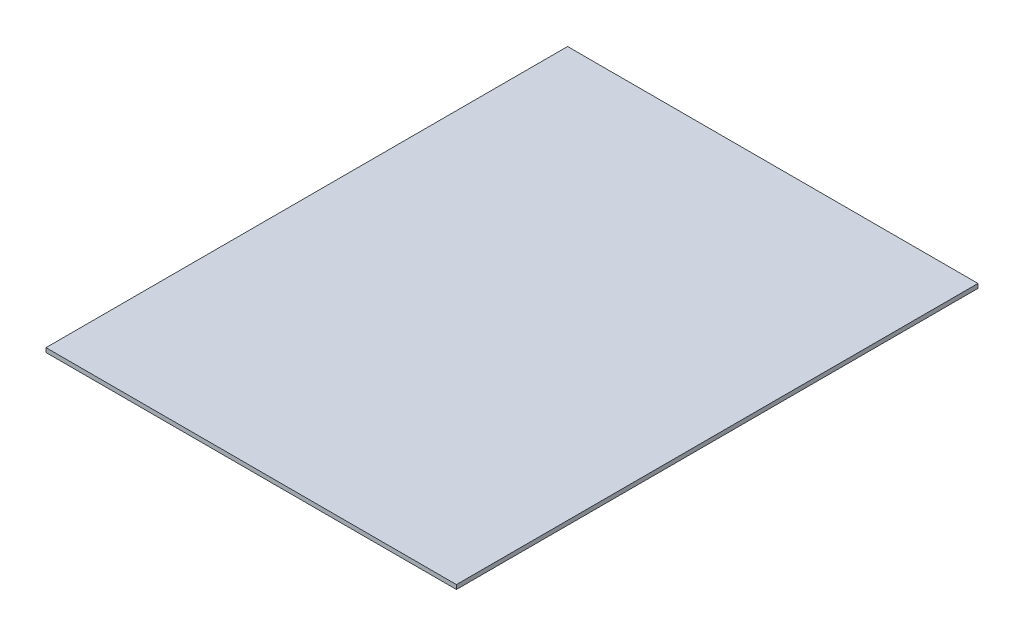
ISO-10303-21;
HEADER;
FILE_DESCRIPTION(('STEP AP214'),'2;1');
FILE_NAME('part.step','',(''),(''),'','','');
FILE_SCHEMA(('AUTOMOTIVE_DESIGN { 1 0 10303 214 1 1 1 1 }'));
ENDSEC;
DATA;
#1=APPLICATION_CONTEXT('core data for automotive mechanical design processes');
#2=APPLICATION_PROTOCOL_DEFINITION('international standard','automotive_design',2000,#1);
#3=PRODUCT_CONTEXT('',#1,'mechanical');
#4=PRODUCT('Part','Part','',(#3));
#5=PRODUCT_RELATED_PRODUCT_CATEGORY('part','',(#4));
#6=PRODUCT_DEFINITION_FORMATION('','',#4);
#7=PRODUCT_DEFINITION_CONTEXT('part definition',#1,'design');
#8=PRODUCT_DEFINITION('design','',#6,#7);
#9=PRODUCT_DEFINITION_SHAPE('','',#8);
#10=(LENGTH_UNIT() NAMED_UNIT(*) SI_UNIT(.MILLI.,.METRE.));
#11=(NAMED_UNIT(*) PLANE_ANGLE_UNIT() SI_UNIT($,.RADIAN.));
#12=(NAMED_UNIT(*) SI_UNIT($,.STERADIAN.) SOLID_ANGLE_UNIT());
#13=UNCERTAINTY_MEASURE_WITH_UNIT(LENGTH_MEASURE(1.E-05),#10,'distance_accuracy_value','');
#14=(GEOMETRIC_REPRESENTATION_CONTEXT(3) GLOBAL_UNCERTAINTY_ASSIGNED_CONTEXT((#13)) GLOBAL_UNIT_ASSIGNED_CONTEXT((#10,
#11,#12)) REPRESENTATION_CONTEXT('',''));
#15=CARTESIAN_POINT('',(0.,0.,0.));
#16=DIRECTION('',(0.,0.,1.));
#17=DIRECTION('',(1.,0.,0.));
#18=AXIS2_PLACEMENT_3D('',#15,#16,#17);
#19=CARTESIAN_POINT('',(152.4,3.175,193.675));
#20=DIRECTION('',(-1.,0.,0.));
#21=DIRECTION('',(0.,0.,1.));
#22=AXIS2_PLACEMENT_3D('',#19,#20,#21);
#23=PLANE('',#22);
#24=DIRECTION('',(0.,0.,-1.));
#25=VECTOR('',#24,1.);
#26=CARTESIAN_POINT('',(152.4,0.,193.675));
#27=LINE('',#26,#25);
#28=CARTESIAN_POINT('',(152.4,0.,193.675));
#29=VERTEX_POINT('',#28);
#30=CARTESIAN_POINT('',(152.4,0.,-193.675));
#31=VERTEX_POINT('',#30);
#32=EDGE_CURVE('E102',#29,#31,#27,.T.);
#33=ORIENTED_EDGE('',*,*,#32,.T.);
#34=DIRECTION('',(0.,-1.,0.));
#35=VECTOR('',#34,1.);
#36=CARTESIAN_POINT('',(152.4,3.175,-193.675));
#37=LINE('',#36,#35);
#38=CARTESIAN_POINT('',(152.4,3.175,-193.675));
#39=VERTEX_POINT('',#38);
#40=EDGE_CURVE('E11',#39,#31,#37,.T.);
#41=ORIENTED_EDGE('',*,*,#40,.F.);
#42=DIRECTION('',(0.,0.,-1.));
#43=VECTOR('',#42,1.);
#44=CARTESIAN_POINT('',(152.4,3.175,193.675));
#45=LINE('',#44,#43);
#46=CARTESIAN_POINT('',(152.4,3.175,193.675));
#47=VERTEX_POINT('',#46);
#48=EDGE_CURVE('E90',#47,#39,#45,.T.);
#49=ORIENTED_EDGE('',*,*,#48,.F.);
#50=DIRECTION('',(0.,-1.,0.));
#51=VECTOR('',#50,1.);
#52=CARTESIAN_POINT('',(152.4,3.175,193.675));
#53=LINE('',#52,#51);
#54=EDGE_CURVE('E98',#47,#29,#53,.T.);
#55=ORIENTED_EDGE('',*,*,#54,.T.);
#56=EDGE_LOOP('',(#33,#41,#49,#55));
#57=FACE_BOUND('',#56,.T.);
#58=ADVANCED_FACE('F39',(#57),#23,.F.);
#59=CARTESIAN_POINT('',(-152.4,3.175,-193.675));
#60=DIRECTION('',(0.,0.,1.));
#61=DIRECTION('',(1.,0.,0.));
#62=AXIS2_PLACEMENT_3D('',#59,#60,#61);
#63=PLANE('',#62);
#64=DIRECTION('',(-1.,0.,0.));
#65=VECTOR('',#64,1.);
#66=CARTESIAN_POINT('',(-152.4,0.,-193.675));
#67=LINE('',#66,#65);
#68=CARTESIAN_POINT('',(-152.4,0.,-193.675));
#69=VERTEX_POINT('',#68);
#70=EDGE_CURVE('E94',#31,#69,#67,.T.);
#71=ORIENTED_EDGE('',*,*,#70,.T.);
#72=DIRECTION('',(0.,-1.,0.));
#73=VECTOR('',#72,1.);
#74=CARTESIAN_POINT('',(-152.4,3.175,-193.675));
#75=LINE('',#74,#73);
#76=CARTESIAN_POINT('',(-152.4,3.175,-193.675));
#77=VERTEX_POINT('',#76);
#78=EDGE_CURVE('E47',#77,#69,#75,.T.);
#79=ORIENTED_EDGE('',*,*,#78,.F.);
#80=DIRECTION('',(-1.,0.,0.));
#81=VECTOR('',#80,1.);
#82=CARTESIAN_POINT('',(-152.4,3.175,-193.675));
#83=LINE('',#82,#81);
#84=EDGE_CURVE('E85',#39,#77,#83,.T.);
#85=ORIENTED_EDGE('',*,*,#84,.F.);
#86=ORIENTED_EDGE('',*,*,#40,.T.);
#87=EDGE_LOOP('',(#71,#79,#85,#86));
#88=FACE_BOUND('',#87,.T.);
#89=ADVANCED_FACE('F93',(#88),#63,.F.);
#90=CARTESIAN_POINT('',(-152.4,3.175,193.675));
#91=DIRECTION('',(1.,0.,0.));
#92=DIRECTION('',(0.,0.,-1.));
#93=AXIS2_PLACEMENT_3D('',#90,#91,#92);
#94=PLANE('',#93);
#95=DIRECTION('',(0.,0.,1.));
#96=VECTOR('',#95,1.);
#97=CARTESIAN_POINT('',(-152.4,0.,193.675));
#98=LINE('',#97,#96);
#99=CARTESIAN_POINT('',(-152.4,0.,193.675));
#100=VERTEX_POINT('',#99);
#101=EDGE_CURVE('E72',#69,#100,#98,.T.);
#102=ORIENTED_EDGE('',*,*,#101,.T.);
#103=DIRECTION('',(0.,-1.,0.));
#104=VECTOR('',#103,1.);
#105=CARTESIAN_POINT('',(-152.4,3.175,193.675));
#106=LINE('',#105,#104);
#107=CARTESIAN_POINT('',(-152.4,3.175,193.675));
#108=VERTEX_POINT('',#107);
#109=EDGE_CURVE('E95',#108,#100,#106,.T.);
#110=ORIENTED_EDGE('',*,*,#109,.F.);
#111=DIRECTION('',(0.,0.,1.));
#112=VECTOR('',#111,1.);
#113=CARTESIAN_POINT('',(-152.4,3.175,193.675));
#114=LINE('',#113,#112);
#115=EDGE_CURVE('E88',#77,#108,#114,.T.);
#116=ORIENTED_EDGE('',*,*,#115,.F.);
#117=ORIENTED_EDGE('',*,*,#78,.T.);
#118=EDGE_LOOP('',(#102,#110,#116,#117));
#119=FACE_BOUND('',#118,.T.);
#120=ADVANCED_FACE('F96',(#119),#94,.F.);
#121=CARTESIAN_POINT('',(-152.4,3.175,193.675));
#122=DIRECTION('',(0.,0.,-1.));
#123=DIRECTION('',(-1.,0.,0.));
#124=AXIS2_PLACEMENT_3D('',#121,#122,#123);
#125=PLANE('',#124);
#126=DIRECTION('',(1.,0.,0.));
#127=VECTOR('',#126,1.);
#128=CARTESIAN_POINT('',(-152.4,0.,193.675));
#129=LINE('',#128,#127);
#130=EDGE_CURVE('E78',#100,#29,#129,.T.);
#131=ORIENTED_EDGE('',*,*,#130,.T.);
#132=ORIENTED_EDGE('',*,*,#54,.F.);
#133=DIRECTION('',(1.,0.,0.));
#134=VECTOR('',#133,1.);
#135=CARTESIAN_POINT('',(-152.4,3.175,193.675));
#136=LINE('',#135,#134);
#137=EDGE_CURVE('E55',#108,#47,#136,.T.);
#138=ORIENTED_EDGE('',*,*,#137,.F.);
#139=ORIENTED_EDGE('',*,*,#109,.T.);
#140=EDGE_LOOP('',(#131,#132,#138,#139));
#141=FACE_BOUND('',#140,.T.);
#142=ADVANCED_FACE('F109',(#141),#125,.F.);
#143=CARTESIAN_POINT('',(0.,3.175,0.));
#144=DIRECTION('',(0.,-1.,0.));
#145=DIRECTION('',(0.,0.,-1.));
#146=AXIS2_PLACEMENT_3D('',#143,#144,#145);
#147=PLANE('',#146);
#148=ORIENTED_EDGE('',*,*,#48,.T.);
#149=ORIENTED_EDGE('',*,*,#84,.T.);
#150=ORIENTED_EDGE('',*,*,#115,.T.);
#151=ORIENTED_EDGE('',*,*,#137,.T.);
#152=EDGE_LOOP('',(#148,#149,#150,#151));
#153=FACE_BOUND('',#152,.T.);
#154=ADVANCED_FACE('F86',(#153),#147,.F.);
#155=CARTESIAN_POINT('',(0.,0.,0.));
#156=DIRECTION('',(0.,-1.,0.));
#157=DIRECTION('',(0.,0.,-1.));
#158=AXIS2_PLACEMENT_3D('',#155,#156,#157);
#159=PLANE('',#158);
#160=ORIENTED_EDGE('',*,*,#32,.F.);
#161=ORIENTED_EDGE('',*,*,#130,.F.);
#162=ORIENTED_EDGE('',*,*,#101,.F.);
#163=ORIENTED_EDGE('',*,*,#70,.F.);
#164=EDGE_LOOP('',(#160,#161,#162,#163));
#165=FACE_BOUND('',#164,.T.);
#166=ADVANCED_FACE('F112',(#165),#159,.T.);
#167=CLOSED_SHELL('',(#58,#89,#120,#142,#154,#166));
#168=MANIFOLD_SOLID_BREP('B2',#167);
#169=ADVANCED_BREP_SHAPE_REPRESENTATION('',(#18,#168),#14);
#170=SHAPE_DEFINITION_REPRESENTATION(#9,#169);
ENDSEC;
END-ISO-10303-21;
